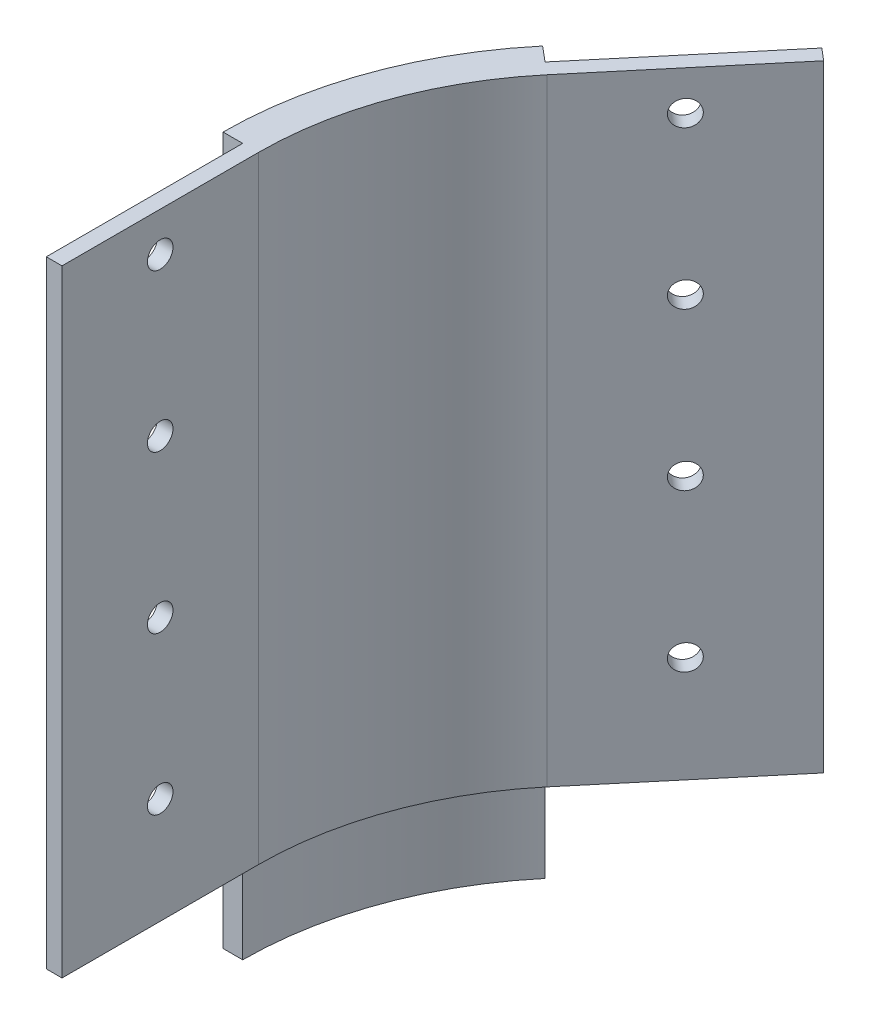
ISO-10303-21;
HEADER;
FILE_DESCRIPTION(('STEP AP214'),'2;1');
FILE_NAME('part.step','',(''),(''),'','','');
FILE_SCHEMA(('AUTOMOTIVE_DESIGN { 1 0 10303 214 1 1 1 1 }'));
ENDSEC;
DATA;
#1=APPLICATION_CONTEXT('core data for automotive mechanical design processes');
#2=APPLICATION_PROTOCOL_DEFINITION('international standard','automotive_design',2000,#1);
#3=PRODUCT_CONTEXT('',#1,'mechanical');
#4=PRODUCT('Part','Part','',(#3));
#5=PRODUCT_RELATED_PRODUCT_CATEGORY('part','',(#4));
#6=PRODUCT_DEFINITION_FORMATION('','',#4);
#7=PRODUCT_DEFINITION_CONTEXT('part definition',#1,'design');
#8=PRODUCT_DEFINITION('design','',#6,#7);
#9=PRODUCT_DEFINITION_SHAPE('','',#8);
#10=(LENGTH_UNIT() NAMED_UNIT(*) SI_UNIT(.MILLI.,.METRE.));
#11=(NAMED_UNIT(*) PLANE_ANGLE_UNIT() SI_UNIT($,.RADIAN.));
#12=(NAMED_UNIT(*) SI_UNIT($,.STERADIAN.) SOLID_ANGLE_UNIT());
#13=UNCERTAINTY_MEASURE_WITH_UNIT(LENGTH_MEASURE(1.E-05),#10,'distance_accuracy_value','');
#14=(GEOMETRIC_REPRESENTATION_CONTEXT(3) GLOBAL_UNCERTAINTY_ASSIGNED_CONTEXT((#13)) GLOBAL_UNIT_ASSIGNED_CONTEXT((#10,
#11,#12)) REPRESENTATION_CONTEXT('',''));
#15=CARTESIAN_POINT('',(0.,0.,0.));
#16=DIRECTION('',(0.,0.,1.));
#17=DIRECTION('',(1.,0.,0.));
#18=AXIS2_PLACEMENT_3D('',#15,#16,#17);
#19=CARTESIAN_POINT('',(6.70784506652562,200.,-59.6418141452981));
#20=DIRECTION('',(-0.64278760968654,0.,0.766044443118977));
#21=DIRECTION('',(0.766044443118978,0.,0.64278760968654));
#22=AXIS2_PLACEMENT_3D('',#19,#20,#21);
#23=PLANE('',#22);
#24=DIRECTION('',(-0.766044443118977,0.,-0.64278760968654));
#25=VECTOR('',#24,1.);
#26=CARTESIAN_POINT('',(6.70784506652562,20.,-59.6418141452981));
#27=LINE('',#26,#25);
#28=CARTESIAN_POINT('',(10.5380672821205,20.,-56.4278760968654));
#29=VERTEX_POINT('',#28);
#30=CARTESIAN_POINT('',(6.70784506652562,20.,-59.6418141452981));
#31=VERTEX_POINT('',#30);
#32=EDGE_CURVE('E150',#29,#31,#27,.T.);
#33=ORIENTED_EDGE('',*,*,#32,.T.);
#34=DIRECTION('',(0.,-1.,0.));
#35=VECTOR('',#34,1.);
#36=CARTESIAN_POINT('',(6.70784506652562,200.,-59.6418141452981));
#37=LINE('',#36,#35);
#38=CARTESIAN_POINT('',(6.70784506652562,200.,-59.6418141452981));
#39=VERTEX_POINT('',#38);
#40=EDGE_CURVE('E43',#39,#31,#37,.T.);
#41=ORIENTED_EDGE('',*,*,#40,.F.);
#42=DIRECTION('',(-0.766044443118977,0.,-0.64278760968654));
#43=VECTOR('',#42,1.);
#44=CARTESIAN_POINT('',(6.70784506652562,200.,-59.6418141452981));
#45=LINE('',#44,#43);
#46=CARTESIAN_POINT('',(10.5380672821205,200.,-56.4278760968654));
#47=VERTEX_POINT('',#46);
#48=EDGE_CURVE('E83',#47,#39,#45,.T.);
#49=ORIENTED_EDGE('',*,*,#48,.F.);
#50=DIRECTION('',(0.,-1.,0.));
#51=VECTOR('',#50,1.);
#52=CARTESIAN_POINT('',(10.5380672821205,200.,-56.4278760968654));
#53=LINE('',#52,#51);
#54=CARTESIAN_POINT('',(10.5380672821205,43.0000000000001,-56.4278760968654));
#55=VERTEX_POINT('',#54);
#56=EDGE_CURVE('E11',#47,#55,#53,.T.);
#57=ORIENTED_EDGE('',*,*,#56,.T.);
#58=DIRECTION('',(0.,-1.,0.));
#59=VECTOR('',#58,1.);
#60=CARTESIAN_POINT('',(10.5380672821205,43.,-56.4278760968654));
#61=LINE('',#60,#59);
#62=EDGE_CURVE('E226',#55,#29,#61,.T.);
#63=ORIENTED_EDGE('',*,*,#62,.T.);
#64=EDGE_LOOP('',(#33,#41,#49,#57,#63));
#65=FACE_BOUND('',#64,.T.);
#66=ADVANCED_FACE('F35',(#65),#23,.F.);
#67=CARTESIAN_POINT('',(77.7861913430201,200.,0.));
#68=DIRECTION('',(0.,-1.,0.));
#69=DIRECTION('',(0.,0.,-1.));
#70=AXIS2_PLACEMENT_3D('',#67,#68,#69);
#71=CYLINDRICAL_SURFACE('',#70,92.7861913430201);
#72=CARTESIAN_POINT('',(77.7861913430201,20.,0.));
#73=DIRECTION('',(0.,1.,0.));
#74=DIRECTION('',(0.,0.,1.));
#75=AXIS2_PLACEMENT_3D('',#72,#73,#74);
#76=CIRCLE('',#75,92.7861913430201);
#77=CARTESIAN_POINT('',(-15.,20.,0.));
#78=VERTEX_POINT('',#77);
#79=EDGE_CURVE('E76',#31,#78,#76,.T.);
#80=ORIENTED_EDGE('',*,*,#79,.T.);
#81=DIRECTION('',(0.,-1.,0.));
#82=VECTOR('',#81,1.);
#83=CARTESIAN_POINT('',(-15.,200.,0.));
#84=LINE('',#83,#82);
#85=CARTESIAN_POINT('',(-15.,200.,0.));
#86=VERTEX_POINT('',#85);
#87=EDGE_CURVE('E176',#86,#78,#84,.T.);
#88=ORIENTED_EDGE('',*,*,#87,.F.);
#89=CARTESIAN_POINT('',(77.7861913430201,200.,0.));
#90=DIRECTION('',(0.,1.,0.));
#91=DIRECTION('',(0.,0.,1.));
#92=AXIS2_PLACEMENT_3D('',#89,#90,#91);
#93=CIRCLE('',#92,92.7861913430201);
#94=EDGE_CURVE('E166',#39,#86,#93,.T.);
#95=ORIENTED_EDGE('',*,*,#94,.F.);
#96=ORIENTED_EDGE('',*,*,#40,.T.);
#97=EDGE_LOOP('',(#80,#88,#95,#96));
#98=FACE_BOUND('',#97,.T.);
#99=ADVANCED_FACE('F216',(#98),#71,.T.);
#100=CARTESIAN_POINT('',(-15.,200.,0.));
#101=DIRECTION('',(0.,0.,-1.));
#102=DIRECTION('',(-1.,0.,0.));
#103=AXIS2_PLACEMENT_3D('',#100,#101,#102);
#104=PLANE('',#103);
#105=DIRECTION('',(1.,0.,0.));
#106=VECTOR('',#105,1.);
#107=CARTESIAN_POINT('',(-15.,20.,0.));
#108=LINE('',#107,#106);
#109=CARTESIAN_POINT('',(-9.99999999999999,20.,0.));
#110=VERTEX_POINT('',#109);
#111=EDGE_CURVE('E167',#78,#110,#108,.T.);
#112=ORIENTED_EDGE('',*,*,#111,.T.);
#113=DIRECTION('',(0.,-1.,0.));
#114=VECTOR('',#113,1.);
#115=CARTESIAN_POINT('',(-9.99999999999999,43.,0.));
#116=LINE('',#115,#114);
#117=CARTESIAN_POINT('',(-9.99999999999999,43.,0.));
#118=VERTEX_POINT('',#117);
#119=EDGE_CURVE('E221',#118,#110,#116,.T.);
#120=ORIENTED_EDGE('',*,*,#119,.F.);
#121=DIRECTION('',(0.,-1.,0.));
#122=VECTOR('',#121,1.);
#123=CARTESIAN_POINT('',(-9.99999999999999,200.,0.));
#124=LINE('',#123,#122);
#125=CARTESIAN_POINT('',(-9.99999999999999,200.,0.));
#126=VERTEX_POINT('',#125);
#127=EDGE_CURVE('E169',#126,#118,#124,.T.);
#128=ORIENTED_EDGE('',*,*,#127,.F.);
#129=DIRECTION('',(1.,0.,0.));
#130=VECTOR('',#129,1.);
#131=CARTESIAN_POINT('',(-15.,200.,0.));
#132=LINE('',#131,#130);
#133=EDGE_CURVE('E60',#86,#126,#132,.T.);
#134=ORIENTED_EDGE('',*,*,#133,.F.);
#135=ORIENTED_EDGE('',*,*,#87,.T.);
#136=EDGE_LOOP('',(#112,#120,#128,#134,#135));
#137=FACE_BOUND('',#136,.T.);
#138=ADVANCED_FACE('F219',(#137),#104,.F.);
#139=CARTESIAN_POINT('',(77.7861913430201,200.,0.));
#140=DIRECTION('',(0.,1.,0.));
#141=DIRECTION('',(0.,0.,1.));
#142=AXIS2_PLACEMENT_3D('',#139,#140,#141);
#143=PLANE('',#142);
#144=ORIENTED_EDGE('',*,*,#133,.T.);
#145=DIRECTION('',(0.,0.,-1.));
#146=VECTOR('',#145,1.);
#147=CARTESIAN_POINT('',(-10.,200.,0.));
#148=LINE('',#147,#146);
#149=CARTESIAN_POINT('',(-10.,200.,50.));
#150=VERTEX_POINT('',#149);
#151=EDGE_CURVE('E190',#150,#126,#148,.T.);
#152=ORIENTED_EDGE('',*,*,#151,.F.);
#153=DIRECTION('',(-1.,0.,0.));
#154=VECTOR('',#153,1.);
#155=CARTESIAN_POINT('',(1.73472347597681E-13,200.,49.9999999999999));
#156=LINE('',#155,#154);
#157=CARTESIAN_POINT('',(-6.00000000000002,200.,50.));
#158=VERTEX_POINT('',#157);
#159=EDGE_CURVE('E194',#158,#150,#156,.T.);
#160=ORIENTED_EDGE('',*,*,#159,.F.);
#161=DIRECTION('',(0.,0.,1.));
#162=VECTOR('',#161,1.);
#163=CARTESIAN_POINT('',(-5.99999999999999,200.,0.));
#164=LINE('',#163,#162);
#165=CARTESIAN_POINT('',(-5.99999999999999,200.,0.));
#166=VERTEX_POINT('',#165);
#167=EDGE_CURVE('E198',#166,#158,#164,.T.);
#168=ORIENTED_EDGE('',*,*,#167,.F.);
#169=CARTESIAN_POINT('',(77.7861913430201,200.,0.));
#170=DIRECTION('',(0.,1.,0.));
#171=DIRECTION('',(0.,0.,1.));
#172=AXIS2_PLACEMENT_3D('',#169,#170,#171);
#173=CIRCLE('',#172,83.7861913430201);
#174=CARTESIAN_POINT('',(13.6022450545964,200.,-53.8567256581192));
#175=VERTEX_POINT('',#174);
#176=EDGE_CURVE('E206',#175,#166,#173,.T.);
#177=ORIENTED_EDGE('',*,*,#176,.F.);
#178=DIRECTION('',(0.642787609686543,0.,-0.766044443118975));
#179=VECTOR('',#178,1.);
#180=CARTESIAN_POINT('',(-18.5371354297307,200.,-15.5545035021705));
#181=LINE('',#180,#179);
#182=CARTESIAN_POINT('',(45.7416255389236,200.,-92.158947814068));
#183=VERTEX_POINT('',#182);
#184=EDGE_CURVE('E209',#175,#183,#181,.T.);
#185=ORIENTED_EDGE('',*,*,#184,.T.);
#186=DIRECTION('',(-0.766044443118976,0.,-0.642787609686542));
#187=VECTOR('',#186,1.);
#188=CARTESIAN_POINT('',(64.2787609686542,200.,-76.6044443118976));
#189=LINE('',#188,#187);
#190=CARTESIAN_POINT('',(42.6774477664477,200.,-94.7300982528141));
#191=VERTEX_POINT('',#190);
#192=EDGE_CURVE('E211',#183,#191,#189,.T.);
#193=ORIENTED_EDGE('',*,*,#192,.T.);
#194=DIRECTION('',(-0.642787609686543,0.,0.766044443118975));
#195=VECTOR('',#194,1.);
#196=CARTESIAN_POINT('',(-21.6013132022066,200.,-18.1256539409167));
#197=LINE('',#196,#195);
#198=EDGE_CURVE('E149',#191,#47,#197,.T.);
#199=ORIENTED_EDGE('',*,*,#198,.T.);
#200=ORIENTED_EDGE('',*,*,#48,.T.);
#201=ORIENTED_EDGE('',*,*,#94,.T.);
#202=EDGE_LOOP('',(#144,#152,#160,#168,#177,#185,#193,#199,#200,#201));
#203=FACE_BOUND('',#202,.T.);
#204=ADVANCED_FACE('F212',(#203),#143,.T.);
#205=CARTESIAN_POINT('',(77.7861913430201,20.,0.));
#206=DIRECTION('',(0.,1.,0.));
#207=DIRECTION('',(0.,0.,1.));
#208=AXIS2_PLACEMENT_3D('',#205,#206,#207);
#209=PLANE('',#208);
#210=ORIENTED_EDGE('',*,*,#32,.F.);
#211=CARTESIAN_POINT('',(77.7861913430202,20.,0.));
#212=DIRECTION('',(0.,-1.,0.));
#213=DIRECTION('',(0.,0.,1.));
#214=AXIS2_PLACEMENT_3D('',#211,#212,#213);
#215=CIRCLE('',#214,87.7861913430202);
#216=EDGE_CURVE('E255',#110,#29,#215,.T.);
#217=ORIENTED_EDGE('',*,*,#216,.F.);
#218=ORIENTED_EDGE('',*,*,#111,.F.);
#219=ORIENTED_EDGE('',*,*,#79,.F.);
#220=EDGE_LOOP('',(#210,#217,#218,#219));
#221=FACE_BOUND('',#220,.T.);
#222=ADVANCED_FACE('F298',(#221),#209,.F.);
#223=CARTESIAN_POINT('',(-10.,-135.093295013004,0.));
#224=DIRECTION('',(1.,0.,0.));
#225=DIRECTION('',(0.,0.,-1.));
#226=AXIS2_PLACEMENT_3D('',#223,#224,#225);
#227=PLANE('',#226);
#228=CARTESIAN_POINT('',(-10.,190.,25.));
#229=DIRECTION('',(-1.,0.,0.));
#230=DIRECTION('',(0.,0.,1.));
#231=AXIS2_PLACEMENT_3D('',#228,#229,#230);
#232=CIRCLE('',#231,3.25);
#233=CARTESIAN_POINT('',(-10.,190.,28.25));
#234=VERTEX_POINT('',#233);
#235=EDGE_CURVE('E183',#234,#234,#232,.T.);
#236=ORIENTED_EDGE('',*,*,#235,.F.);
#237=EDGE_LOOP('',(#236));
#238=FACE_BOUND('',#237,.T.);
#239=CARTESIAN_POINT('',(-10.,150.,25.));
#240=DIRECTION('',(-1.,0.,0.));
#241=DIRECTION('',(0.,0.,1.));
#242=AXIS2_PLACEMENT_3D('',#239,#240,#241);
#243=CIRCLE('',#242,3.25);
#244=CARTESIAN_POINT('',(-10.,150.,28.25));
#245=VERTEX_POINT('',#244);
#246=EDGE_CURVE('E285',#245,#245,#243,.T.);
#247=ORIENTED_EDGE('',*,*,#246,.F.);
#248=EDGE_LOOP('',(#247));
#249=FACE_BOUND('',#248,.T.);
#250=CARTESIAN_POINT('',(-10.,110.,25.));
#251=DIRECTION('',(-1.,0.,0.));
#252=DIRECTION('',(0.,0.,1.));
#253=AXIS2_PLACEMENT_3D('',#250,#251,#252);
#254=CIRCLE('',#253,3.25);
#255=CARTESIAN_POINT('',(-10.,110.,28.25));
#256=VERTEX_POINT('',#255);
#257=EDGE_CURVE('E287',#256,#256,#254,.T.);
#258=ORIENTED_EDGE('',*,*,#257,.F.);
#259=EDGE_LOOP('',(#258));
#260=FACE_BOUND('',#259,.T.);
#261=CARTESIAN_POINT('',(-10.,70.,25.));
#262=DIRECTION('',(-1.,0.,0.));
#263=DIRECTION('',(0.,0.,1.));
#264=AXIS2_PLACEMENT_3D('',#261,#262,#263);
#265=CIRCLE('',#264,3.25);
#266=CARTESIAN_POINT('',(-10.,70.,28.25));
#267=VERTEX_POINT('',#266);
#268=EDGE_CURVE('E201',#267,#267,#265,.T.);
#269=ORIENTED_EDGE('',*,*,#268,.F.);
#270=EDGE_LOOP('',(#269));
#271=FACE_BOUND('',#270,.T.);
#272=ORIENTED_EDGE('',*,*,#127,.T.);
#273=DIRECTION('',(0.,0.,-1.));
#274=VECTOR('',#273,1.);
#275=CARTESIAN_POINT('',(-10.,43.,50.));
#276=LINE('',#275,#274);
#277=CARTESIAN_POINT('',(-10.,43.,50.));
#278=VERTEX_POINT('',#277);
#279=EDGE_CURVE('E224',#278,#118,#276,.T.);
#280=ORIENTED_EDGE('',*,*,#279,.F.);
#281=DIRECTION('',(0.,1.,0.));
#282=VECTOR('',#281,1.);
#283=CARTESIAN_POINT('',(-10.,-135.093295013004,50.));
#284=LINE('',#283,#282);
#285=EDGE_CURVE('E163',#278,#150,#284,.T.);
#286=ORIENTED_EDGE('',*,*,#285,.T.);
#287=ORIENTED_EDGE('',*,*,#151,.T.);
#288=EDGE_LOOP('',(#272,#280,#286,#287));
#289=FACE_BOUND('',#288,.T.);
#290=ADVANCED_FACE('F223',(#238,#249,#260,#271,#289),#227,.F.);
#291=CARTESIAN_POINT('',(1.73472347597681E-13,-135.093295013004,49.9999999999999));
#292=DIRECTION('',(0.,0.,-1.));
#293=DIRECTION('',(-1.,0.,0.));
#294=AXIS2_PLACEMENT_3D('',#291,#292,#293);
#295=PLANE('',#294);
#296=ORIENTED_EDGE('',*,*,#285,.F.);
#297=DIRECTION('',(-1.,0.,0.));
#298=VECTOR('',#297,1.);
#299=CARTESIAN_POINT('',(-6.00000000000002,43.,50.));
#300=LINE('',#299,#298);
#301=CARTESIAN_POINT('',(-6.00000000000002,43.,50.));
#302=VERTEX_POINT('',#301);
#303=EDGE_CURVE('E227',#302,#278,#300,.T.);
#304=ORIENTED_EDGE('',*,*,#303,.F.);
#305=DIRECTION('',(0.,1.,0.));
#306=VECTOR('',#305,1.);
#307=CARTESIAN_POINT('',(-6.00000000000002,-135.093295013004,50.));
#308=LINE('',#307,#306);
#309=EDGE_CURVE('E161',#302,#158,#308,.T.);
#310=ORIENTED_EDGE('',*,*,#309,.T.);
#311=ORIENTED_EDGE('',*,*,#159,.T.);
#312=EDGE_LOOP('',(#296,#304,#310,#311));
#313=FACE_BOUND('',#312,.T.);
#314=ADVANCED_FACE('F231',(#313),#295,.F.);
#315=CARTESIAN_POINT('',(-5.99999999999999,-135.093295013004,0.));
#316=DIRECTION('',(-1.,0.,0.));
#317=DIRECTION('',(0.,0.,1.));
#318=AXIS2_PLACEMENT_3D('',#315,#316,#317);
#319=PLANE('',#318);
#320=CARTESIAN_POINT('',(-6.00000000000001,190.,25.));
#321=DIRECTION('',(-1.,0.,0.));
#322=DIRECTION('',(0.,0.,1.));
#323=AXIS2_PLACEMENT_3D('',#320,#321,#322);
#324=CIRCLE('',#323,3.25);
#325=CARTESIAN_POINT('',(-6.00000000000001,190.,28.25));
#326=VERTEX_POINT('',#325);
#327=EDGE_CURVE('E38',#326,#326,#324,.T.);
#328=ORIENTED_EDGE('',*,*,#327,.T.);
#329=EDGE_LOOP('',(#328));
#330=FACE_BOUND('',#329,.T.);
#331=CARTESIAN_POINT('',(-6.00000000000001,150.,25.));
#332=DIRECTION('',(-1.,0.,0.));
#333=DIRECTION('',(0.,0.,1.));
#334=AXIS2_PLACEMENT_3D('',#331,#332,#333);
#335=CIRCLE('',#334,3.25);
#336=CARTESIAN_POINT('',(-6.00000000000001,150.,28.25));
#337=VERTEX_POINT('',#336);
#338=EDGE_CURVE('E185',#337,#337,#335,.T.);
#339=ORIENTED_EDGE('',*,*,#338,.T.);
#340=EDGE_LOOP('',(#339));
#341=FACE_BOUND('',#340,.T.);
#342=CARTESIAN_POINT('',(-6.00000000000001,110.,25.));
#343=DIRECTION('',(-1.,0.,0.));
#344=DIRECTION('',(0.,0.,1.));
#345=AXIS2_PLACEMENT_3D('',#342,#343,#344);
#346=CIRCLE('',#345,3.25);
#347=CARTESIAN_POINT('',(-6.00000000000001,110.,28.25));
#348=VERTEX_POINT('',#347);
#349=EDGE_CURVE('E182',#348,#348,#346,.T.);
#350=ORIENTED_EDGE('',*,*,#349,.T.);
#351=EDGE_LOOP('',(#350));
#352=FACE_BOUND('',#351,.T.);
#353=CARTESIAN_POINT('',(-6.00000000000001,70.,25.));
#354=DIRECTION('',(-1.,0.,0.));
#355=DIRECTION('',(0.,0.,1.));
#356=AXIS2_PLACEMENT_3D('',#353,#354,#355);
#357=CIRCLE('',#356,3.25);
#358=CARTESIAN_POINT('',(-6.00000000000001,70.,28.25));
#359=VERTEX_POINT('',#358);
#360=EDGE_CURVE('E179',#359,#359,#357,.T.);
#361=ORIENTED_EDGE('',*,*,#360,.T.);
#362=EDGE_LOOP('',(#361));
#363=FACE_BOUND('',#362,.T.);
#364=ORIENTED_EDGE('',*,*,#309,.F.);
#365=DIRECTION('',(0.,0.,1.));
#366=VECTOR('',#365,1.);
#367=CARTESIAN_POINT('',(-5.99999999999999,43.,0.));
#368=LINE('',#367,#366);
#369=CARTESIAN_POINT('',(-5.99999999999999,43.,0.));
#370=VERTEX_POINT('',#369);
#371=EDGE_CURVE('E241',#370,#302,#368,.T.);
#372=ORIENTED_EDGE('',*,*,#371,.F.);
#373=DIRECTION('',(0.,1.,0.));
#374=VECTOR('',#373,1.);
#375=CARTESIAN_POINT('',(-5.99999999999999,-135.093295013004,0.));
#376=LINE('',#375,#374);
#377=EDGE_CURVE('E159',#370,#166,#376,.T.);
#378=ORIENTED_EDGE('',*,*,#377,.T.);
#379=ORIENTED_EDGE('',*,*,#167,.T.);
#380=EDGE_LOOP('',(#364,#372,#378,#379));
#381=FACE_BOUND('',#380,.T.);
#382=ADVANCED_FACE('F238',(#330,#341,#352,#363,#381),#319,.F.);
#383=CARTESIAN_POINT('',(77.7861913430201,-135.093295013004,0.));
#384=DIRECTION('',(0.,1.,0.));
#385=DIRECTION('',(0.,0.,1.));
#386=AXIS2_PLACEMENT_3D('',#383,#384,#385);
#387=CYLINDRICAL_SURFACE('',#386,83.7861913430201);
#388=ORIENTED_EDGE('',*,*,#377,.F.);
#389=CARTESIAN_POINT('',(77.7861913430201,43.,0.));
#390=DIRECTION('',(0.,1.,0.));
#391=DIRECTION('',(0.,0.,-1.));
#392=AXIS2_PLACEMENT_3D('',#389,#390,#391);
#393=CIRCLE('',#392,83.7861913430201);
#394=CARTESIAN_POINT('',(13.6022450545964,43.,-53.8567256581192));
#395=VERTEX_POINT('',#394);
#396=EDGE_CURVE('E246',#395,#370,#393,.T.);
#397=ORIENTED_EDGE('',*,*,#396,.F.);
#398=DIRECTION('',(0.,1.,0.));
#399=VECTOR('',#398,1.);
#400=CARTESIAN_POINT('',(13.6022450545964,-135.093295013004,-53.8567256581192));
#401=LINE('',#400,#399);
#402=EDGE_CURVE('E153',#395,#175,#401,.T.);
#403=ORIENTED_EDGE('',*,*,#402,.T.);
#404=ORIENTED_EDGE('',*,*,#176,.T.);
#405=EDGE_LOOP('',(#388,#397,#403,#404));
#406=FACE_BOUND('',#405,.T.);
#407=ADVANCED_FACE('F244',(#406),#387,.F.);
#408=CARTESIAN_POINT('',(-18.5371354297307,-135.093295013004,-15.5545035021705));
#409=DIRECTION('',(0.766044443118975,0.,0.642787609686543));
#410=DIRECTION('',(0.642787609686543,0.,-0.766044443118975));
#411=AXIS2_PLACEMENT_3D('',#408,#409,#410);
#412=PLANE('',#411);
#413=DIRECTION('',(-0.642787609686543,0.,0.766044443118975));
#414=VECTOR('',#413,1.);
#415=CARTESIAN_POINT('',(45.7416255389236,43.,-92.158947814068));
#416=LINE('',#415,#414);
#417=CARTESIAN_POINT('',(45.7416255389236,43.,-92.158947814068));
#418=VERTEX_POINT('',#417);
#419=EDGE_CURVE('E143',#418,#395,#416,.T.);
#420=ORIENTED_EDGE('',*,*,#419,.F.);
#421=DIRECTION('',(0.,1.,0.));
#422=VECTOR('',#421,1.);
#423=CARTESIAN_POINT('',(45.7416255389236,-135.093295013004,-92.158947814068));
#424=LINE('',#423,#422);
#425=EDGE_CURVE('E142',#418,#183,#424,.T.);
#426=ORIENTED_EDGE('',*,*,#425,.T.);
#427=ORIENTED_EDGE('',*,*,#184,.F.);
#428=ORIENTED_EDGE('',*,*,#402,.F.);
#429=EDGE_LOOP('',(#420,#426,#427,#428));
#430=FACE_BOUND('',#429,.T.);
#431=CARTESIAN_POINT('',(29.67193529676,190.,-73.0078367360937));
#432=DIRECTION('',(0.766044443118975,0.,0.642787609686543));
#433=DIRECTION('',(0.642787609686543,0.,-0.766044443118975));
#434=AXIS2_PLACEMENT_3D('',#431,#432,#433);
#435=CIRCLE('',#434,3.25);
#436=CARTESIAN_POINT('',(31.7609950282413,190.,-75.4974811762303));
#437=VERTEX_POINT('',#436);
#438=EDGE_CURVE('E280',#437,#437,#435,.F.);
#439=ORIENTED_EDGE('',*,*,#438,.T.);
#440=EDGE_LOOP('',(#439));
#441=FACE_BOUND('',#440,.T.);
#442=CARTESIAN_POINT('',(29.67193529676,150.,-73.0078367360937));
#443=DIRECTION('',(0.766044443118975,0.,0.642787609686543));
#444=DIRECTION('',(0.642787609686543,0.,-0.766044443118975));
#445=AXIS2_PLACEMENT_3D('',#442,#443,#444);
#446=CIRCLE('',#445,3.25);
#447=CARTESIAN_POINT('',(31.7609950282413,150.,-75.4974811762303));
#448=VERTEX_POINT('',#447);
#449=EDGE_CURVE('E277',#448,#448,#446,.F.);
#450=ORIENTED_EDGE('',*,*,#449,.T.);
#451=EDGE_LOOP('',(#450));
#452=FACE_BOUND('',#451,.T.);
#453=CARTESIAN_POINT('',(29.67193529676,110.,-73.0078367360937));
#454=DIRECTION('',(0.766044443118975,0.,0.642787609686543));
#455=DIRECTION('',(0.642787609686543,0.,-0.766044443118975));
#456=AXIS2_PLACEMENT_3D('',#453,#454,#455);
#457=CIRCLE('',#456,3.25);
#458=CARTESIAN_POINT('',(31.7609950282413,110.,-75.4974811762303));
#459=VERTEX_POINT('',#458);
#460=EDGE_CURVE('E274',#459,#459,#457,.F.);
#461=ORIENTED_EDGE('',*,*,#460,.T.);
#462=EDGE_LOOP('',(#461));
#463=FACE_BOUND('',#462,.T.);
#464=CARTESIAN_POINT('',(29.67193529676,70.,-73.0078367360937));
#465=DIRECTION('',(0.766044443118975,0.,0.642787609686543));
#466=DIRECTION('',(0.642787609686543,0.,-0.766044443118975));
#467=AXIS2_PLACEMENT_3D('',#464,#465,#466);
#468=CIRCLE('',#467,3.25);
#469=CARTESIAN_POINT('',(31.7609950282413,70.,-75.4974811762303));
#470=VERTEX_POINT('',#469);
#471=EDGE_CURVE('E263',#470,#470,#468,.F.);
#472=ORIENTED_EDGE('',*,*,#471,.T.);
#473=EDGE_LOOP('',(#472));
#474=FACE_BOUND('',#473,.T.);
#475=ADVANCED_FACE('F248',(#430,#441,#452,#463,#474),#412,.T.);
#476=CARTESIAN_POINT('',(64.2787609686542,-135.093295013004,-76.6044443118976));
#477=DIRECTION('',(0.642787609686542,0.,-0.766044443118976));
#478=DIRECTION('',(-0.766044443118976,0.,-0.642787609686542));
#479=AXIS2_PLACEMENT_3D('',#476,#477,#478);
#480=PLANE('',#479);
#481=DIRECTION('',(0.76604444311898,0.,0.642787609686536));
#482=VECTOR('',#481,1.);
#483=CARTESIAN_POINT('',(42.6774477664477,43.,-94.7300982528141));
#484=LINE('',#483,#482);
#485=CARTESIAN_POINT('',(42.6774477664477,43.,-94.7300982528141));
#486=VERTEX_POINT('',#485);
#487=EDGE_CURVE('E131',#486,#418,#484,.T.);
#488=ORIENTED_EDGE('',*,*,#487,.F.);
#489=DIRECTION('',(0.,1.,0.));
#490=VECTOR('',#489,1.);
#491=CARTESIAN_POINT('',(42.6774477664477,-135.093295013004,-94.7300982528141));
#492=LINE('',#491,#490);
#493=EDGE_CURVE('E140',#486,#191,#492,.T.);
#494=ORIENTED_EDGE('',*,*,#493,.T.);
#495=ORIENTED_EDGE('',*,*,#192,.F.);
#496=ORIENTED_EDGE('',*,*,#425,.F.);
#497=EDGE_LOOP('',(#488,#494,#495,#496));
#498=FACE_BOUND('',#497,.T.);
#499=ADVANCED_FACE('F138',(#498),#480,.T.);
#500=CARTESIAN_POINT('',(-21.6013132022066,-135.093295013004,-18.1256539409167));
#501=DIRECTION('',(-0.766044443118975,0.,-0.642787609686543));
#502=DIRECTION('',(-0.642787609686543,0.,0.766044443118975));
#503=AXIS2_PLACEMENT_3D('',#500,#501,#502);
#504=PLANE('',#503);
#505=DIRECTION('',(0.642787609686544,0.,-0.766044443118974));
#506=VECTOR('',#505,1.);
#507=CARTESIAN_POINT('',(10.5380672821205,43.,-56.4278760968654));
#508=LINE('',#507,#506);
#509=EDGE_CURVE('E128',#55,#486,#508,.T.);
#510=ORIENTED_EDGE('',*,*,#509,.F.);
#511=ORIENTED_EDGE('',*,*,#56,.F.);
#512=ORIENTED_EDGE('',*,*,#198,.F.);
#513=ORIENTED_EDGE('',*,*,#493,.F.);
#514=EDGE_LOOP('',(#510,#511,#512,#513));
#515=FACE_BOUND('',#514,.T.);
#516=CARTESIAN_POINT('',(26.6077575242839,190.,-75.57898717484));
#517=DIRECTION('',(0.766044443118978,0.,0.642787609686539));
#518=DIRECTION('',(0.642787609686539,0.,-0.766044443118978));
#519=AXIS2_PLACEMENT_3D('',#516,#517,#518);
#520=CIRCLE('',#519,3.25);
#521=CARTESIAN_POINT('',(28.6968172557651,190.,-78.0686316149767));
#522=VERTEX_POINT('',#521);
#523=EDGE_CURVE('E260',#522,#522,#520,.T.);
#524=ORIENTED_EDGE('',*,*,#523,.T.);
#525=EDGE_LOOP('',(#524));
#526=FACE_BOUND('',#525,.T.);
#527=CARTESIAN_POINT('',(26.6077575242839,150.,-75.57898717484));
#528=DIRECTION('',(0.766044443118978,0.,0.642787609686539));
#529=DIRECTION('',(0.642787609686539,0.,-0.766044443118978));
#530=AXIS2_PLACEMENT_3D('',#527,#528,#529);
#531=CIRCLE('',#530,3.25);
#532=CARTESIAN_POINT('',(28.6968172557651,150.,-78.0686316149767));
#533=VERTEX_POINT('',#532);
#534=EDGE_CURVE('E264',#533,#533,#531,.T.);
#535=ORIENTED_EDGE('',*,*,#534,.T.);
#536=EDGE_LOOP('',(#535));
#537=FACE_BOUND('',#536,.T.);
#538=CARTESIAN_POINT('',(26.6077575242839,110.,-75.57898717484));
#539=DIRECTION('',(0.766044443118978,0.,0.642787609686539));
#540=DIRECTION('',(0.642787609686539,0.,-0.766044443118978));
#541=AXIS2_PLACEMENT_3D('',#538,#539,#540);
#542=CIRCLE('',#541,3.25);
#543=CARTESIAN_POINT('',(28.6968172557651,110.,-78.0686316149767));
#544=VERTEX_POINT('',#543);
#545=EDGE_CURVE('E267',#544,#544,#542,.T.);
#546=ORIENTED_EDGE('',*,*,#545,.T.);
#547=EDGE_LOOP('',(#546));
#548=FACE_BOUND('',#547,.T.);
#549=CARTESIAN_POINT('',(26.6077575242839,70.,-75.57898717484));
#550=DIRECTION('',(0.766044443118978,0.,0.642787609686539));
#551=DIRECTION('',(0.642787609686539,0.,-0.766044443118978));
#552=AXIS2_PLACEMENT_3D('',#549,#550,#551);
#553=CIRCLE('',#552,3.25);
#554=CARTESIAN_POINT('',(28.6968172557651,70.,-78.0686316149767));
#555=VERTEX_POINT('',#554);
#556=EDGE_CURVE('E258',#555,#555,#553,.T.);
#557=ORIENTED_EDGE('',*,*,#556,.T.);
#558=EDGE_LOOP('',(#557));
#559=FACE_BOUND('',#558,.T.);
#560=ADVANCED_FACE('F146',(#515,#526,#537,#548,#559),#504,.T.);
#561=CARTESIAN_POINT('',(45.7416255389236,70.,25.));
#562=DIRECTION('',(-1.,0.,0.));
#563=DIRECTION('',(0.,0.,1.));
#564=AXIS2_PLACEMENT_3D('',#561,#562,#563);
#565=CYLINDRICAL_SURFACE('',#564,3.25);
#566=ORIENTED_EDGE('',*,*,#268,.T.);
#567=EDGE_LOOP('',(#566));
#568=FACE_BOUND('',#567,.T.);
#569=ORIENTED_EDGE('',*,*,#360,.F.);
#570=EDGE_LOOP('',(#569));
#571=FACE_BOUND('',#570,.T.);
#572=ADVANCED_FACE('F294',(#568,#571),#565,.F.);
#573=CARTESIAN_POINT('',(45.7416255389236,110.,25.));
#574=DIRECTION('',(-1.,0.,0.));
#575=DIRECTION('',(0.,0.,1.));
#576=AXIS2_PLACEMENT_3D('',#573,#574,#575);
#577=CYLINDRICAL_SURFACE('',#576,3.25);
#578=ORIENTED_EDGE('',*,*,#257,.T.);
#579=EDGE_LOOP('',(#578));
#580=FACE_BOUND('',#579,.T.);
#581=ORIENTED_EDGE('',*,*,#349,.F.);
#582=EDGE_LOOP('',(#581));
#583=FACE_BOUND('',#582,.T.);
#584=ADVANCED_FACE('F391',(#580,#583),#577,.F.);
#585=CARTESIAN_POINT('',(45.7416255389236,150.,25.));
#586=DIRECTION('',(-1.,0.,0.));
#587=DIRECTION('',(0.,0.,1.));
#588=AXIS2_PLACEMENT_3D('',#585,#586,#587);
#589=CYLINDRICAL_SURFACE('',#588,3.25);
#590=ORIENTED_EDGE('',*,*,#246,.T.);
#591=EDGE_LOOP('',(#590));
#592=FACE_BOUND('',#591,.T.);
#593=ORIENTED_EDGE('',*,*,#338,.F.);
#594=EDGE_LOOP('',(#593));
#595=FACE_BOUND('',#594,.T.);
#596=ADVANCED_FACE('F397',(#592,#595),#589,.F.);
#597=CARTESIAN_POINT('',(45.7416255389236,190.,25.));
#598=DIRECTION('',(-1.,0.,0.));
#599=DIRECTION('',(0.,0.,1.));
#600=AXIS2_PLACEMENT_3D('',#597,#598,#599);
#601=CYLINDRICAL_SURFACE('',#600,3.25);
#602=ORIENTED_EDGE('',*,*,#235,.T.);
#603=EDGE_LOOP('',(#602));
#604=FACE_BOUND('',#603,.T.);
#605=ORIENTED_EDGE('',*,*,#327,.F.);
#606=EDGE_LOOP('',(#605));
#607=FACE_BOUND('',#606,.T.);
#608=ADVANCED_FACE('F404',(#604,#607),#601,.F.);
#609=CARTESIAN_POINT('',(99.6715522804361,70.,-14.2711839425401));
#610=DIRECTION('',(-0.766044443118978,0.,-0.642787609686539));
#611=DIRECTION('',(-0.642787609686539,0.,0.766044443118978));
#612=AXIS2_PLACEMENT_3D('',#609,#610,#611);
#613=CYLINDRICAL_SURFACE('',#612,3.25);
#614=ORIENTED_EDGE('',*,*,#471,.F.);
#615=EDGE_LOOP('',(#614));
#616=FACE_BOUND('',#615,.T.);
#617=ORIENTED_EDGE('',*,*,#556,.F.);
#618=EDGE_LOOP('',(#617));
#619=FACE_BOUND('',#618,.T.);
#620=ADVANCED_FACE('F412',(#616,#619),#613,.F.);
#621=CARTESIAN_POINT('',(99.6715522804361,110.,-14.2711839425401));
#622=DIRECTION('',(-0.766044443118978,0.,-0.642787609686539));
#623=DIRECTION('',(-0.642787609686539,0.,0.766044443118978));
#624=AXIS2_PLACEMENT_3D('',#621,#622,#623);
#625=CYLINDRICAL_SURFACE('',#624,3.25);
#626=ORIENTED_EDGE('',*,*,#460,.F.);
#627=EDGE_LOOP('',(#626));
#628=FACE_BOUND('',#627,.T.);
#629=ORIENTED_EDGE('',*,*,#545,.F.);
#630=EDGE_LOOP('',(#629));
#631=FACE_BOUND('',#630,.T.);
#632=ADVANCED_FACE('F420',(#628,#631),#625,.F.);
#633=CARTESIAN_POINT('',(99.6715522804361,150.,-14.2711839425401));
#634=DIRECTION('',(-0.766044443118978,0.,-0.642787609686539));
#635=DIRECTION('',(-0.642787609686539,0.,0.766044443118978));
#636=AXIS2_PLACEMENT_3D('',#633,#634,#635);
#637=CYLINDRICAL_SURFACE('',#636,3.25);
#638=ORIENTED_EDGE('',*,*,#449,.F.);
#639=EDGE_LOOP('',(#638));
#640=FACE_BOUND('',#639,.T.);
#641=ORIENTED_EDGE('',*,*,#534,.F.);
#642=EDGE_LOOP('',(#641));
#643=FACE_BOUND('',#642,.T.);
#644=ADVANCED_FACE('F428',(#640,#643),#637,.F.);
#645=CARTESIAN_POINT('',(99.6715522804361,190.,-14.2711839425401));
#646=DIRECTION('',(-0.766044443118978,0.,-0.642787609686539));
#647=DIRECTION('',(-0.642787609686539,0.,0.766044443118978));
#648=AXIS2_PLACEMENT_3D('',#645,#646,#647);
#649=CYLINDRICAL_SURFACE('',#648,3.25);
#650=ORIENTED_EDGE('',*,*,#438,.F.);
#651=EDGE_LOOP('',(#650));
#652=FACE_BOUND('',#651,.T.);
#653=ORIENTED_EDGE('',*,*,#523,.F.);
#654=EDGE_LOOP('',(#653));
#655=FACE_BOUND('',#654,.T.);
#656=ADVANCED_FACE('F436',(#652,#655),#649,.F.);
#657=CARTESIAN_POINT('',(77.7861913430202,43.,0.));
#658=DIRECTION('',(0.,-1.,0.));
#659=DIRECTION('',(0.,0.,-1.));
#660=AXIS2_PLACEMENT_3D('',#657,#658,#659);
#661=CYLINDRICAL_SURFACE('',#660,87.7861913430202);
#662=ORIENTED_EDGE('',*,*,#216,.T.);
#663=ORIENTED_EDGE('',*,*,#62,.F.);
#664=CARTESIAN_POINT('',(77.7861913430202,43.,0.));
#665=DIRECTION('',(0.,-1.,0.));
#666=DIRECTION('',(0.,0.,1.));
#667=AXIS2_PLACEMENT_3D('',#664,#665,#666);
#668=CIRCLE('',#667,87.7861913430202);
#669=EDGE_CURVE('E51',#118,#55,#668,.T.);
#670=ORIENTED_EDGE('',*,*,#669,.F.);
#671=ORIENTED_EDGE('',*,*,#119,.T.);
#672=EDGE_LOOP('',(#662,#663,#670,#671));
#673=FACE_BOUND('',#672,.T.);
#674=ADVANCED_FACE('F443',(#673),#661,.F.);
#675=CARTESIAN_POINT('',(77.7861913430202,43.,0.));
#676=DIRECTION('',(0.,1.,0.));
#677=DIRECTION('',(0.,0.,1.));
#678=AXIS2_PLACEMENT_3D('',#675,#676,#677);
#679=PLANE('',#678);
#680=ORIENTED_EDGE('',*,*,#669,.T.);
#681=ORIENTED_EDGE('',*,*,#509,.T.);
#682=ORIENTED_EDGE('',*,*,#487,.T.);
#683=ORIENTED_EDGE('',*,*,#419,.T.);
#684=ORIENTED_EDGE('',*,*,#396,.T.);
#685=ORIENTED_EDGE('',*,*,#371,.T.);
#686=ORIENTED_EDGE('',*,*,#303,.T.);
#687=ORIENTED_EDGE('',*,*,#279,.T.);
#688=EDGE_LOOP('',(#680,#681,#682,#683,#684,#685,#686,#687));
#689=FACE_BOUND('',#688,.T.);
#690=ADVANCED_FACE('F130',(#689),#679,.F.);
#691=CLOSED_SHELL('',(#66,#99,#138,#204,#222,#290,#314,#382,#407,#475,#499,#560,#572,#584,#596,
#608,#620,#632,#644,#656,#674,#690));
#692=MANIFOLD_SOLID_BREP('B2',#691);
#693=ADVANCED_BREP_SHAPE_REPRESENTATION('',(#18,#692),#14);
#694=SHAPE_DEFINITION_REPRESENTATION(#9,#693);
ENDSEC;
END-ISO-10303-21;
